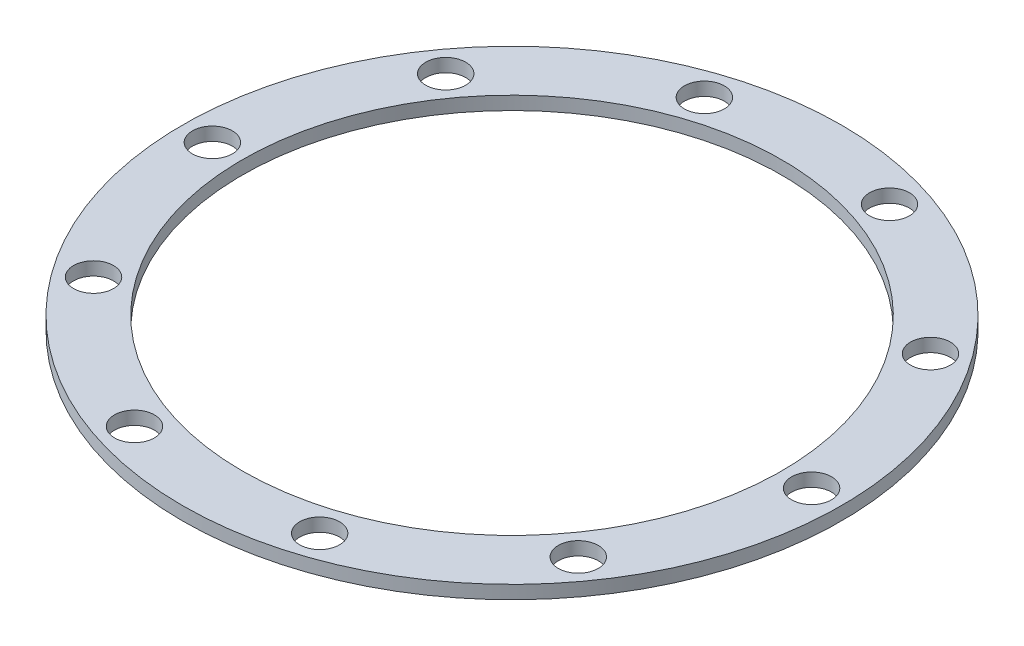
ISO-10303-21;
HEADER;
FILE_DESCRIPTION(('STEP AP214'),'2;1');
FILE_NAME('part.step','',(''),(''),'','','');
FILE_SCHEMA(('AUTOMOTIVE_DESIGN { 1 0 10303 214 1 1 1 1 }'));
ENDSEC;
DATA;
#1=APPLICATION_CONTEXT('core data for automotive mechanical design processes');
#2=APPLICATION_PROTOCOL_DEFINITION('international standard','automotive_design',2000,#1);
#3=PRODUCT_CONTEXT('',#1,'mechanical');
#4=PRODUCT('Part','Part','',(#3));
#5=PRODUCT_RELATED_PRODUCT_CATEGORY('part','',(#4));
#6=PRODUCT_DEFINITION_FORMATION('','',#4);
#7=PRODUCT_DEFINITION_CONTEXT('part definition',#1,'design');
#8=PRODUCT_DEFINITION('design','',#6,#7);
#9=PRODUCT_DEFINITION_SHAPE('','',#8);
#10=(LENGTH_UNIT() NAMED_UNIT(*) SI_UNIT(.MILLI.,.METRE.));
#11=(NAMED_UNIT(*) PLANE_ANGLE_UNIT() SI_UNIT($,.RADIAN.));
#12=(NAMED_UNIT(*) SI_UNIT($,.STERADIAN.) SOLID_ANGLE_UNIT());
#13=UNCERTAINTY_MEASURE_WITH_UNIT(LENGTH_MEASURE(1.E-05),#10,'distance_accuracy_value','');
#14=(GEOMETRIC_REPRESENTATION_CONTEXT(3) GLOBAL_UNCERTAINTY_ASSIGNED_CONTEXT((#13)) GLOBAL_UNIT_ASSIGNED_CONTEXT((#10,
#11,#12)) REPRESENTATION_CONTEXT('',''));
#15=CARTESIAN_POINT('',(0.,0.,0.));
#16=DIRECTION('',(0.,0.,1.));
#17=DIRECTION('',(1.,0.,0.));
#18=AXIS2_PLACEMENT_3D('',#15,#16,#17);
#19=CARTESIAN_POINT('',(0.,2.,0.));
#20=DIRECTION('',(0.,1.,0.));
#21=DIRECTION('',(0.,0.,1.));
#22=AXIS2_PLACEMENT_3D('',#19,#20,#21);
#23=PLANE('',#22);
#24=CARTESIAN_POINT('',(72.811529493746,2.,-52.9006727063216));
#25=DIRECTION('',(0.,1.,0.));
#26=DIRECTION('',(0.,0.,1.));
#27=AXIS2_PLACEMENT_3D('',#24,#25,#26);
#28=CIRCLE('',#27,6.);
#29=CARTESIAN_POINT('',(72.811529493746,2.,-46.9006727063216));
#30=VERTEX_POINT('',#29);
#31=EDGE_CURVE('E105',#30,#30,#28,.T.);
#32=ORIENTED_EDGE('',*,*,#31,.F.);
#33=EDGE_LOOP('',(#32));
#34=FACE_BOUND('',#33,.T.);
#35=CARTESIAN_POINT('',(-27.8115294937445,2.,-85.5950864665641));
#36=DIRECTION('',(0.,1.,0.));
#37=DIRECTION('',(0.,0.,1.));
#38=AXIS2_PLACEMENT_3D('',#35,#36,#37);
#39=CIRCLE('',#38,6.);
#40=CARTESIAN_POINT('',(-27.8115294937445,2.,-79.5950864665641));
#41=VERTEX_POINT('',#40);
#42=EDGE_CURVE('E93',#41,#41,#39,.T.);
#43=ORIENTED_EDGE('',*,*,#42,.F.);
#44=EDGE_LOOP('',(#43));
#45=FACE_BOUND('',#44,.T.);
#46=CARTESIAN_POINT('',(-90.,2.,-6.27969898303604E-13));
#47=DIRECTION('',(0.,1.,0.));
#48=DIRECTION('',(0.,0.,1.));
#49=AXIS2_PLACEMENT_3D('',#46,#47,#48);
#50=CIRCLE('',#49,6.);
#51=CARTESIAN_POINT('',(-90.,2.,5.99999999999937));
#52=VERTEX_POINT('',#51);
#53=EDGE_CURVE('E81',#52,#52,#50,.T.);
#54=ORIENTED_EDGE('',*,*,#53,.F.);
#55=EDGE_LOOP('',(#54));
#56=FACE_BOUND('',#55,.T.);
#57=CARTESIAN_POINT('',(-27.8115294937456,2.,85.5950864665637));
#58=DIRECTION('',(0.,1.,0.));
#59=DIRECTION('',(0.,0.,1.));
#60=AXIS2_PLACEMENT_3D('',#57,#58,#59);
#61=CIRCLE('',#60,6.);
#62=CARTESIAN_POINT('',(-27.8115294937456,2.,91.5950864665637));
#63=VERTEX_POINT('',#62);
#64=EDGE_CURVE('E69',#63,#63,#61,.T.);
#65=ORIENTED_EDGE('',*,*,#64,.F.);
#66=EDGE_LOOP('',(#65));
#67=FACE_BOUND('',#66,.T.);
#68=CARTESIAN_POINT('',(72.8115294937452,2.,52.9006727063227));
#69=DIRECTION('',(0.,1.,0.));
#70=DIRECTION('',(0.,0.,1.));
#71=AXIS2_PLACEMENT_3D('',#68,#69,#70);
#72=CIRCLE('',#71,5.99999999999999);
#73=CARTESIAN_POINT('',(72.8115294937452,2.,58.9006727063227));
#74=VERTEX_POINT('',#73);
#75=EDGE_CURVE('E57',#74,#74,#72,.T.);
#76=ORIENTED_EDGE('',*,*,#75,.F.);
#77=EDGE_LOOP('',(#76));
#78=FACE_BOUND('',#77,.T.);
#79=CARTESIAN_POINT('',(0.,2.,0.));
#80=DIRECTION('',(0.,1.,0.));
#81=DIRECTION('',(0.,0.,1.));
#82=AXIS2_PLACEMENT_3D('',#79,#80,#81);
#83=CIRCLE('',#82,99.);
#84=CARTESIAN_POINT('',(0.,2.,99.));
#85=VERTEX_POINT('',#84);
#86=EDGE_CURVE('E10',#85,#85,#83,.T.);
#87=ORIENTED_EDGE('',*,*,#86,.T.);
#88=EDGE_LOOP('',(#87));
#89=FACE_BOUND('',#88,.T.);
#90=CARTESIAN_POINT('',(90.,2.,0.));
#91=DIRECTION('',(0.,1.,0.));
#92=DIRECTION('',(0.,0.,1.));
#93=AXIS2_PLACEMENT_3D('',#90,#91,#92);
#94=CIRCLE('',#93,6.);
#95=CARTESIAN_POINT('',(90.,2.,6.));
#96=VERTEX_POINT('',#95);
#97=EDGE_CURVE('E52',#96,#96,#94,.T.);
#98=ORIENTED_EDGE('',*,*,#97,.F.);
#99=EDGE_LOOP('',(#98));
#100=FACE_BOUND('',#99,.T.);
#101=CARTESIAN_POINT('',(27.811529493745,2.,85.5950864665639));
#102=DIRECTION('',(0.,1.,0.));
#103=DIRECTION('',(0.,0.,1.));
#104=AXIS2_PLACEMENT_3D('',#101,#102,#103);
#105=CIRCLE('',#104,6.00000000000002);
#106=CARTESIAN_POINT('',(27.811529493745,2.,91.5950864665639));
#107=VERTEX_POINT('',#106);
#108=EDGE_CURVE('E63',#107,#107,#105,.T.);
#109=ORIENTED_EDGE('',*,*,#108,.F.);
#110=EDGE_LOOP('',(#109));
#111=FACE_BOUND('',#110,.T.);
#112=CARTESIAN_POINT('',(-72.8115294937456,2.,52.9006727063222));
#113=DIRECTION('',(0.,1.,0.));
#114=DIRECTION('',(0.,0.,1.));
#115=AXIS2_PLACEMENT_3D('',#112,#113,#114);
#116=CIRCLE('',#115,6.);
#117=CARTESIAN_POINT('',(-72.8115294937456,2.,58.9006727063222));
#118=VERTEX_POINT('',#117);
#119=EDGE_CURVE('E75',#118,#118,#116,.T.);
#120=ORIENTED_EDGE('',*,*,#119,.F.);
#121=EDGE_LOOP('',(#120));
#122=FACE_BOUND('',#121,.T.);
#123=CARTESIAN_POINT('',(-72.8115294937448,2.,-52.9006727063232));
#124=DIRECTION('',(0.,1.,0.));
#125=DIRECTION('',(0.,0.,1.));
#126=AXIS2_PLACEMENT_3D('',#123,#124,#125);
#127=CIRCLE('',#126,6.);
#128=CARTESIAN_POINT('',(-72.8115294937448,2.,-46.9006727063232));
#129=VERTEX_POINT('',#128);
#130=EDGE_CURVE('E87',#129,#129,#127,.T.);
#131=ORIENTED_EDGE('',*,*,#130,.F.);
#132=EDGE_LOOP('',(#131));
#133=FACE_BOUND('',#132,.T.);
#134=CARTESIAN_POINT('',(27.8115294937462,2.,-85.5950864665635));
#135=DIRECTION('',(0.,1.,0.));
#136=DIRECTION('',(0.,0.,1.));
#137=AXIS2_PLACEMENT_3D('',#134,#135,#136);
#138=CIRCLE('',#137,5.99999999999999);
#139=CARTESIAN_POINT('',(27.8115294937462,2.,-79.5950864665635));
#140=VERTEX_POINT('',#139);
#141=EDGE_CURVE('E99',#140,#140,#138,.T.);
#142=ORIENTED_EDGE('',*,*,#141,.F.);
#143=EDGE_LOOP('',(#142));
#144=FACE_BOUND('',#143,.T.);
#145=CARTESIAN_POINT('',(0.,2.,0.));
#146=DIRECTION('',(0.,1.,0.));
#147=DIRECTION('',(0.,0.,1.));
#148=AXIS2_PLACEMENT_3D('',#145,#146,#147);
#149=CIRCLE('',#148,81.);
#150=CARTESIAN_POINT('',(0.,2.,81.));
#151=VERTEX_POINT('',#150);
#152=EDGE_CURVE('E111',#151,#151,#149,.T.);
#153=ORIENTED_EDGE('',*,*,#152,.F.);
#154=EDGE_LOOP('',(#153));
#155=FACE_BOUND('',#154,.T.);
#156=ADVANCED_FACE('F41',(#34,#45,#56,#67,#78,#89,#100,#111,#122,#133,#144,#155),#23,.T.);
#157=CARTESIAN_POINT('',(0.,-2.,0.));
#158=DIRECTION('',(0.,1.,0.));
#159=DIRECTION('',(0.,0.,1.));
#160=AXIS2_PLACEMENT_3D('',#157,#158,#159);
#161=PLANE('',#160);
#162=CARTESIAN_POINT('',(0.,-2.,0.));
#163=DIRECTION('',(0.,1.,0.));
#164=DIRECTION('',(0.,0.,1.));
#165=AXIS2_PLACEMENT_3D('',#162,#163,#164);
#166=CIRCLE('',#165,99.);
#167=CARTESIAN_POINT('',(0.,-2.,99.));
#168=VERTEX_POINT('',#167);
#169=EDGE_CURVE('E45',#168,#168,#166,.T.);
#170=ORIENTED_EDGE('',*,*,#169,.F.);
#171=EDGE_LOOP('',(#170));
#172=FACE_BOUND('',#171,.T.);
#173=CARTESIAN_POINT('',(90.,-2.,0.));
#174=DIRECTION('',(0.,1.,0.));
#175=DIRECTION('',(0.,0.,1.));
#176=AXIS2_PLACEMENT_3D('',#173,#174,#175);
#177=CIRCLE('',#176,6.);
#178=CARTESIAN_POINT('',(90.,-2.,6.));
#179=VERTEX_POINT('',#178);
#180=EDGE_CURVE('E54',#179,#179,#177,.T.);
#181=ORIENTED_EDGE('',*,*,#180,.T.);
#182=EDGE_LOOP('',(#181));
#183=FACE_BOUND('',#182,.T.);
#184=CARTESIAN_POINT('',(72.8115294937452,-2.,52.9006727063227));
#185=DIRECTION('',(0.,1.,0.));
#186=DIRECTION('',(0.,0.,1.));
#187=AXIS2_PLACEMENT_3D('',#184,#185,#186);
#188=CIRCLE('',#187,5.99999999999999);
#189=CARTESIAN_POINT('',(72.8115294937452,-2.,58.9006727063227));
#190=VERTEX_POINT('',#189);
#191=EDGE_CURVE('E60',#190,#190,#188,.T.);
#192=ORIENTED_EDGE('',*,*,#191,.T.);
#193=EDGE_LOOP('',(#192));
#194=FACE_BOUND('',#193,.T.);
#195=CARTESIAN_POINT('',(27.811529493745,-2.,85.5950864665639));
#196=DIRECTION('',(0.,1.,0.));
#197=DIRECTION('',(0.,0.,1.));
#198=AXIS2_PLACEMENT_3D('',#195,#196,#197);
#199=CIRCLE('',#198,6.00000000000002);
#200=CARTESIAN_POINT('',(27.811529493745,-2.,91.5950864665639));
#201=VERTEX_POINT('',#200);
#202=EDGE_CURVE('E66',#201,#201,#199,.T.);
#203=ORIENTED_EDGE('',*,*,#202,.T.);
#204=EDGE_LOOP('',(#203));
#205=FACE_BOUND('',#204,.T.);
#206=CARTESIAN_POINT('',(-27.8115294937456,-2.,85.5950864665637));
#207=DIRECTION('',(0.,1.,0.));
#208=DIRECTION('',(0.,0.,1.));
#209=AXIS2_PLACEMENT_3D('',#206,#207,#208);
#210=CIRCLE('',#209,6.);
#211=CARTESIAN_POINT('',(-27.8115294937456,-2.,91.5950864665637));
#212=VERTEX_POINT('',#211);
#213=EDGE_CURVE('E72',#212,#212,#210,.T.);
#214=ORIENTED_EDGE('',*,*,#213,.T.);
#215=EDGE_LOOP('',(#214));
#216=FACE_BOUND('',#215,.T.);
#217=CARTESIAN_POINT('',(-72.8115294937456,-2.,52.9006727063222));
#218=DIRECTION('',(0.,1.,0.));
#219=DIRECTION('',(0.,0.,1.));
#220=AXIS2_PLACEMENT_3D('',#217,#218,#219);
#221=CIRCLE('',#220,6.);
#222=CARTESIAN_POINT('',(-72.8115294937456,-2.,58.9006727063222));
#223=VERTEX_POINT('',#222);
#224=EDGE_CURVE('E78',#223,#223,#221,.T.);
#225=ORIENTED_EDGE('',*,*,#224,.T.);
#226=EDGE_LOOP('',(#225));
#227=FACE_BOUND('',#226,.T.);
#228=CARTESIAN_POINT('',(-90.,-2.,-6.27969898303604E-13));
#229=DIRECTION('',(0.,1.,0.));
#230=DIRECTION('',(0.,0.,1.));
#231=AXIS2_PLACEMENT_3D('',#228,#229,#230);
#232=CIRCLE('',#231,6.);
#233=CARTESIAN_POINT('',(-90.,-2.,5.99999999999937));
#234=VERTEX_POINT('',#233);
#235=EDGE_CURVE('E84',#234,#234,#232,.T.);
#236=ORIENTED_EDGE('',*,*,#235,.T.);
#237=EDGE_LOOP('',(#236));
#238=FACE_BOUND('',#237,.T.);
#239=CARTESIAN_POINT('',(-72.8115294937448,-2.,-52.9006727063232));
#240=DIRECTION('',(0.,1.,0.));
#241=DIRECTION('',(0.,0.,1.));
#242=AXIS2_PLACEMENT_3D('',#239,#240,#241);
#243=CIRCLE('',#242,6.);
#244=CARTESIAN_POINT('',(-72.8115294937448,-2.,-46.9006727063232));
#245=VERTEX_POINT('',#244);
#246=EDGE_CURVE('E90',#245,#245,#243,.T.);
#247=ORIENTED_EDGE('',*,*,#246,.T.);
#248=EDGE_LOOP('',(#247));
#249=FACE_BOUND('',#248,.T.);
#250=CARTESIAN_POINT('',(-27.8115294937445,-2.,-85.5950864665641));
#251=DIRECTION('',(0.,1.,0.));
#252=DIRECTION('',(0.,0.,1.));
#253=AXIS2_PLACEMENT_3D('',#250,#251,#252);
#254=CIRCLE('',#253,6.);
#255=CARTESIAN_POINT('',(-27.8115294937445,-2.,-79.5950864665641));
#256=VERTEX_POINT('',#255);
#257=EDGE_CURVE('E96',#256,#256,#254,.T.);
#258=ORIENTED_EDGE('',*,*,#257,.T.);
#259=EDGE_LOOP('',(#258));
#260=FACE_BOUND('',#259,.T.);
#261=CARTESIAN_POINT('',(27.8115294937462,-2.,-85.5950864665635));
#262=DIRECTION('',(0.,1.,0.));
#263=DIRECTION('',(0.,0.,1.));
#264=AXIS2_PLACEMENT_3D('',#261,#262,#263);
#265=CIRCLE('',#264,5.99999999999999);
#266=CARTESIAN_POINT('',(27.8115294937462,-2.,-79.5950864665635));
#267=VERTEX_POINT('',#266);
#268=EDGE_CURVE('E102',#267,#267,#265,.T.);
#269=ORIENTED_EDGE('',*,*,#268,.T.);
#270=EDGE_LOOP('',(#269));
#271=FACE_BOUND('',#270,.T.);
#272=CARTESIAN_POINT('',(72.811529493746,-2.,-52.9006727063216));
#273=DIRECTION('',(0.,1.,0.));
#274=DIRECTION('',(0.,0.,1.));
#275=AXIS2_PLACEMENT_3D('',#272,#273,#274);
#276=CIRCLE('',#275,6.);
#277=CARTESIAN_POINT('',(72.811529493746,-2.,-46.9006727063216));
#278=VERTEX_POINT('',#277);
#279=EDGE_CURVE('E108',#278,#278,#276,.T.);
#280=ORIENTED_EDGE('',*,*,#279,.T.);
#281=EDGE_LOOP('',(#280));
#282=FACE_BOUND('',#281,.T.);
#283=CARTESIAN_POINT('',(0.,-2.,0.));
#284=DIRECTION('',(0.,1.,0.));
#285=DIRECTION('',(0.,0.,1.));
#286=AXIS2_PLACEMENT_3D('',#283,#284,#285);
#287=CIRCLE('',#286,81.);
#288=CARTESIAN_POINT('',(0.,-2.,81.));
#289=VERTEX_POINT('',#288);
#290=EDGE_CURVE('E114',#289,#289,#287,.T.);
#291=ORIENTED_EDGE('',*,*,#290,.T.);
#292=EDGE_LOOP('',(#291));
#293=FACE_BOUND('',#292,.T.);
#294=ADVANCED_FACE('F124',(#172,#183,#194,#205,#216,#227,#238,#249,#260,#271,#282,#293),#161,.F.);
#295=CARTESIAN_POINT('',(0.,2.,0.));
#296=DIRECTION('',(0.,-1.,0.));
#297=DIRECTION('',(0.,0.,-1.));
#298=AXIS2_PLACEMENT_3D('',#295,#296,#297);
#299=CYLINDRICAL_SURFACE('',#298,99.);
#300=ORIENTED_EDGE('',*,*,#86,.F.);
#301=EDGE_LOOP('',(#300));
#302=FACE_BOUND('',#301,.T.);
#303=ORIENTED_EDGE('',*,*,#169,.T.);
#304=EDGE_LOOP('',(#303));
#305=FACE_BOUND('',#304,.T.);
#306=ADVANCED_FACE('F43',(#302,#305),#299,.T.);
#307=CARTESIAN_POINT('',(90.,2.,0.));
#308=DIRECTION('',(0.,-1.,0.));
#309=DIRECTION('',(0.,0.,-1.));
#310=AXIS2_PLACEMENT_3D('',#307,#308,#309);
#311=CYLINDRICAL_SURFACE('',#310,6.);
#312=ORIENTED_EDGE('',*,*,#97,.T.);
#313=EDGE_LOOP('',(#312));
#314=FACE_BOUND('',#313,.T.);
#315=ORIENTED_EDGE('',*,*,#180,.F.);
#316=EDGE_LOOP('',(#315));
#317=FACE_BOUND('',#316,.T.);
#318=ADVANCED_FACE('F134',(#314,#317),#311,.F.);
#319=CARTESIAN_POINT('',(72.8115294937452,2.,52.9006727063227));
#320=DIRECTION('',(0.,-1.,0.));
#321=DIRECTION('',(0.,0.,-1.));
#322=AXIS2_PLACEMENT_3D('',#319,#320,#321);
#323=CYLINDRICAL_SURFACE('',#322,5.99999999999999);
#324=ORIENTED_EDGE('',*,*,#75,.T.);
#325=EDGE_LOOP('',(#324));
#326=FACE_BOUND('',#325,.T.);
#327=ORIENTED_EDGE('',*,*,#191,.F.);
#328=EDGE_LOOP('',(#327));
#329=FACE_BOUND('',#328,.T.);
#330=ADVANCED_FACE('F137',(#326,#329),#323,.F.);
#331=CARTESIAN_POINT('',(27.811529493745,2.,85.5950864665639));
#332=DIRECTION('',(0.,-1.,0.));
#333=DIRECTION('',(0.,0.,-1.));
#334=AXIS2_PLACEMENT_3D('',#331,#332,#333);
#335=CYLINDRICAL_SURFACE('',#334,6.00000000000002);
#336=ORIENTED_EDGE('',*,*,#108,.T.);
#337=EDGE_LOOP('',(#336));
#338=FACE_BOUND('',#337,.T.);
#339=ORIENTED_EDGE('',*,*,#202,.F.);
#340=EDGE_LOOP('',(#339));
#341=FACE_BOUND('',#340,.T.);
#342=ADVANCED_FACE('F141',(#338,#341),#335,.F.);
#343=CARTESIAN_POINT('',(-27.8115294937456,2.,85.5950864665637));
#344=DIRECTION('',(0.,-1.,0.));
#345=DIRECTION('',(0.,0.,-1.));
#346=AXIS2_PLACEMENT_3D('',#343,#344,#345);
#347=CYLINDRICAL_SURFACE('',#346,6.);
#348=ORIENTED_EDGE('',*,*,#64,.T.);
#349=EDGE_LOOP('',(#348));
#350=FACE_BOUND('',#349,.T.);
#351=ORIENTED_EDGE('',*,*,#213,.F.);
#352=EDGE_LOOP('',(#351));
#353=FACE_BOUND('',#352,.T.);
#354=ADVANCED_FACE('F145',(#350,#353),#347,.F.);
#355=CARTESIAN_POINT('',(-72.8115294937456,2.,52.9006727063222));
#356=DIRECTION('',(0.,-1.,0.));
#357=DIRECTION('',(0.,0.,-1.));
#358=AXIS2_PLACEMENT_3D('',#355,#356,#357);
#359=CYLINDRICAL_SURFACE('',#358,6.);
#360=ORIENTED_EDGE('',*,*,#119,.T.);
#361=EDGE_LOOP('',(#360));
#362=FACE_BOUND('',#361,.T.);
#363=ORIENTED_EDGE('',*,*,#224,.F.);
#364=EDGE_LOOP('',(#363));
#365=FACE_BOUND('',#364,.T.);
#366=ADVANCED_FACE('F149',(#362,#365),#359,.F.);
#367=CARTESIAN_POINT('',(-90.,2.,-6.27969898303604E-13));
#368=DIRECTION('',(0.,-1.,0.));
#369=DIRECTION('',(0.,0.,-1.));
#370=AXIS2_PLACEMENT_3D('',#367,#368,#369);
#371=CYLINDRICAL_SURFACE('',#370,6.);
#372=ORIENTED_EDGE('',*,*,#53,.T.);
#373=EDGE_LOOP('',(#372));
#374=FACE_BOUND('',#373,.T.);
#375=ORIENTED_EDGE('',*,*,#235,.F.);
#376=EDGE_LOOP('',(#375));
#377=FACE_BOUND('',#376,.T.);
#378=ADVANCED_FACE('F153',(#374,#377),#371,.F.);
#379=CARTESIAN_POINT('',(-72.8115294937448,2.,-52.9006727063232));
#380=DIRECTION('',(0.,-1.,0.));
#381=DIRECTION('',(0.,0.,-1.));
#382=AXIS2_PLACEMENT_3D('',#379,#380,#381);
#383=CYLINDRICAL_SURFACE('',#382,6.);
#384=ORIENTED_EDGE('',*,*,#130,.T.);
#385=EDGE_LOOP('',(#384));
#386=FACE_BOUND('',#385,.T.);
#387=ORIENTED_EDGE('',*,*,#246,.F.);
#388=EDGE_LOOP('',(#387));
#389=FACE_BOUND('',#388,.T.);
#390=ADVANCED_FACE('F157',(#386,#389),#383,.F.);
#391=CARTESIAN_POINT('',(-27.8115294937445,2.,-85.5950864665641));
#392=DIRECTION('',(0.,-1.,0.));
#393=DIRECTION('',(0.,0.,-1.));
#394=AXIS2_PLACEMENT_3D('',#391,#392,#393);
#395=CYLINDRICAL_SURFACE('',#394,6.);
#396=ORIENTED_EDGE('',*,*,#42,.T.);
#397=EDGE_LOOP('',(#396));
#398=FACE_BOUND('',#397,.T.);
#399=ORIENTED_EDGE('',*,*,#257,.F.);
#400=EDGE_LOOP('',(#399));
#401=FACE_BOUND('',#400,.T.);
#402=ADVANCED_FACE('F161',(#398,#401),#395,.F.);
#403=CARTESIAN_POINT('',(27.8115294937462,2.,-85.5950864665635));
#404=DIRECTION('',(0.,-1.,0.));
#405=DIRECTION('',(0.,0.,-1.));
#406=AXIS2_PLACEMENT_3D('',#403,#404,#405);
#407=CYLINDRICAL_SURFACE('',#406,5.99999999999999);
#408=ORIENTED_EDGE('',*,*,#141,.T.);
#409=EDGE_LOOP('',(#408));
#410=FACE_BOUND('',#409,.T.);
#411=ORIENTED_EDGE('',*,*,#268,.F.);
#412=EDGE_LOOP('',(#411));
#413=FACE_BOUND('',#412,.T.);
#414=ADVANCED_FACE('F165',(#410,#413),#407,.F.);
#415=CARTESIAN_POINT('',(72.811529493746,2.,-52.9006727063216));
#416=DIRECTION('',(0.,-1.,0.));
#417=DIRECTION('',(0.,0.,-1.));
#418=AXIS2_PLACEMENT_3D('',#415,#416,#417);
#419=CYLINDRICAL_SURFACE('',#418,6.);
#420=ORIENTED_EDGE('',*,*,#31,.T.);
#421=EDGE_LOOP('',(#420));
#422=FACE_BOUND('',#421,.T.);
#423=ORIENTED_EDGE('',*,*,#279,.F.);
#424=EDGE_LOOP('',(#423));
#425=FACE_BOUND('',#424,.T.);
#426=ADVANCED_FACE('F169',(#422,#425),#419,.F.);
#427=CARTESIAN_POINT('',(0.,2.,0.));
#428=DIRECTION('',(0.,-1.,0.));
#429=DIRECTION('',(0.,0.,-1.));
#430=AXIS2_PLACEMENT_3D('',#427,#428,#429);
#431=CYLINDRICAL_SURFACE('',#430,81.);
#432=ORIENTED_EDGE('',*,*,#152,.T.);
#433=EDGE_LOOP('',(#432));
#434=FACE_BOUND('',#433,.T.);
#435=ORIENTED_EDGE('',*,*,#290,.F.);
#436=EDGE_LOOP('',(#435));
#437=FACE_BOUND('',#436,.T.);
#438=ADVANCED_FACE('F120',(#434,#437),#431,.F.);
#439=CLOSED_SHELL('',(#156,#294,#306,#318,#330,#342,#354,#366,#378,#390,#402,#414,#426,#438));
#440=MANIFOLD_SOLID_BREP('B2',#439);
#441=ADVANCED_BREP_SHAPE_REPRESENTATION('',(#18,#440),#14);
#442=SHAPE_DEFINITION_REPRESENTATION(#9,#441);
ENDSEC;
END-ISO-10303-21;
